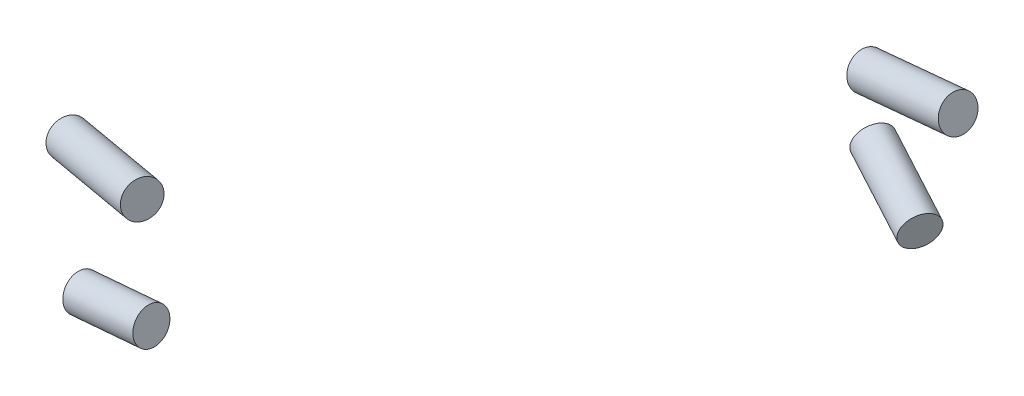
ISO-10303-21;
HEADER;
FILE_DESCRIPTION(('STEP AP214'),'2;1');
FILE_NAME('part.step','',(''),(''),'','','');
FILE_SCHEMA(('AUTOMOTIVE_DESIGN { 1 0 10303 214 1 1 1 1 }'));
ENDSEC;
DATA;
#1=APPLICATION_CONTEXT('core data for automotive mechanical design processes');
#2=APPLICATION_PROTOCOL_DEFINITION('international standard','automotive_design',2000,#1);
#3=PRODUCT_CONTEXT('',#1,'mechanical');
#4=PRODUCT('Part','Part','',(#3));
#5=PRODUCT_RELATED_PRODUCT_CATEGORY('part','',(#4));
#6=PRODUCT_DEFINITION_FORMATION('','',#4);
#7=PRODUCT_DEFINITION_CONTEXT('part definition',#1,'design');
#8=PRODUCT_DEFINITION('design','',#6,#7);
#9=PRODUCT_DEFINITION_SHAPE('','',#8);
#10=(LENGTH_UNIT() NAMED_UNIT(*) SI_UNIT(.MILLI.,.METRE.));
#11=(NAMED_UNIT(*) PLANE_ANGLE_UNIT() SI_UNIT($,.RADIAN.));
#12=(NAMED_UNIT(*) SI_UNIT($,.STERADIAN.) SOLID_ANGLE_UNIT());
#13=UNCERTAINTY_MEASURE_WITH_UNIT(LENGTH_MEASURE(1.E-05),#10,'distance_accuracy_value','');
#14=(GEOMETRIC_REPRESENTATION_CONTEXT(3) GLOBAL_UNCERTAINTY_ASSIGNED_CONTEXT((#13)) GLOBAL_UNIT_ASSIGNED_CONTEXT((#10,
#11,#12)) REPRESENTATION_CONTEXT('',''));
#15=CARTESIAN_POINT('',(0.,0.,0.));
#16=DIRECTION('',(0.,0.,1.));
#17=DIRECTION('',(1.,0.,0.));
#18=AXIS2_PLACEMENT_3D('',#15,#16,#17);
#19=CARTESIAN_POINT('',(-164.805861,4.04738961000001,-478.324842));
#20=DIRECTION('',(-0.971273965039373,-0.203382569261322,-0.123541148437916));
#21=DIRECTION('',(0.204952618983025,-0.978771895781647,0.));
#22=AXIS2_PLACEMENT_3D('',#19,#20,#21);
#23=PLANE('',#22);
#24=CARTESIAN_POINT('',(-164.805861,4.04738961000001,-478.324842));
#25=DIRECTION('',(-0.971273965039373,-0.203382569261322,-0.123541148437916));
#26=DIRECTION('',(0.204952618983025,-0.978771895781647,0.));
#27=AXIS2_PLACEMENT_3D('',#24,#25,#26);
#28=CIRCLE('',#27,7.00000000000002);
#29=CARTESIAN_POINT('',(-163.371192667119,-2.80401366047154,-478.324842));
#30=VERTEX_POINT('',#29);
#31=EDGE_CURVE('E80',#30,#30,#28,.T.);
#32=ORIENTED_EDGE('',*,*,#31,.F.);
#33=EDGE_LOOP('',(#32));
#34=FACE_BOUND('',#33,.T.);
#35=ADVANCED_FACE('F74',(#34),#23,.F.);
#36=CARTESIAN_POINT('',(-206.559789,-4.69578837999999,-483.635731));
#37=DIRECTION('',(-0.971273965039373,-0.203382569261322,-0.123541148437916));
#38=DIRECTION('',(0.204952618983025,-0.978771895781647,0.));
#39=AXIS2_PLACEMENT_3D('',#36,#37,#38);
#40=PLANE('',#39);
#41=CARTESIAN_POINT('',(-206.559789,-4.69578837999999,-483.635731));
#42=DIRECTION('',(-0.971273965039373,-0.203382569261322,-0.123541148437916));
#43=DIRECTION('',(0.204952618983025,-0.978771895781647,0.));
#44=AXIS2_PLACEMENT_3D('',#41,#42,#43);
#45=CIRCLE('',#44,7.00000000000002);
#46=CARTESIAN_POINT('',(-205.125120667119,-11.5471916504715,-483.635731));
#47=VERTEX_POINT('',#46);
#48=EDGE_CURVE('E12',#47,#47,#45,.T.);
#49=ORIENTED_EDGE('',*,*,#48,.T.);
#50=EDGE_LOOP('',(#49));
#51=FACE_BOUND('',#50,.T.);
#52=ADVANCED_FACE('F89',(#51),#40,.T.);
#53=CARTESIAN_POINT('',(-164.805861,4.04738961000001,-478.324842));
#54=DIRECTION('',(-0.971273965039373,-0.203382569261323,-0.123541148437915));
#55=DIRECTION('',(0.204952618983025,-0.978771895781647,0.));
#56=AXIS2_PLACEMENT_3D('',#53,#54,#55);
#57=CYLINDRICAL_SURFACE('',#56,7.00000000000002);
#58=ORIENTED_EDGE('',*,*,#48,.F.);
#59=EDGE_LOOP('',(#58));
#60=FACE_BOUND('',#59,.T.);
#61=ORIENTED_EDGE('',*,*,#31,.T.);
#62=EDGE_LOOP('',(#61));
#63=FACE_BOUND('',#62,.T.);
#64=ADVANCED_FACE('F86',(#60,#63),#57,.T.);
#65=CLOSED_SHELL('',(#35,#52,#64));
#66=MANIFOLD_SOLID_BREP('B2',#65);
#67=CARTESIAN_POINT('',(-166.026177,-30.2321009,-464.318765));
#68=DIRECTION('',(-0.89786021332966,0.222717447003682,-0.379794649935699));
#69=DIRECTION('',(-0.389579708465379,0.,0.920992752822751));
#70=AXIS2_PLACEMENT_3D('',#67,#68,#69);
#71=PLANE('',#70);
#72=CARTESIAN_POINT('',(-166.026177,-30.2321009,-464.318765));
#73=DIRECTION('',(-0.89786021332966,0.222717447003682,-0.379794649935699));
#74=DIRECTION('',(-0.389579708465379,0.,0.920992752822751));
#75=AXIS2_PLACEMENT_3D('',#72,#73,#74);
#76=CIRCLE('',#75,6.99999999999999);
#77=CARTESIAN_POINT('',(-168.753234959258,-30.2321009,-457.871815730241));
#78=VERTEX_POINT('',#77);
#79=EDGE_CURVE('E141',#78,#78,#76,.T.);
#80=ORIENTED_EDGE('',*,*,#79,.F.);
#81=EDGE_LOOP('',(#80));
#82=FACE_BOUND('',#81,.T.);
#83=ADVANCED_FACE('F135',(#82),#71,.F.);
#84=CARTESIAN_POINT('',(-198.557411,-22.1626116,-478.079469));
#85=DIRECTION('',(-0.89786021332966,0.222717447003682,-0.379794649935699));
#86=DIRECTION('',(-0.389579708465379,0.,0.920992752822751));
#87=AXIS2_PLACEMENT_3D('',#84,#85,#86);
#88=PLANE('',#87);
#89=CARTESIAN_POINT('',(-198.557411,-22.1626116,-478.079469));
#90=DIRECTION('',(-0.89786021332966,0.222717447003682,-0.379794649935699));
#91=DIRECTION('',(-0.389579708465379,0.,0.920992752822751));
#92=AXIS2_PLACEMENT_3D('',#89,#90,#91);
#93=CIRCLE('',#92,6.99999999999999);
#94=CARTESIAN_POINT('',(-201.284468959258,-22.1626116,-471.632519730241));
#95=VERTEX_POINT('',#94);
#96=EDGE_CURVE('E73',#95,#95,#93,.T.);
#97=ORIENTED_EDGE('',*,*,#96,.T.);
#98=EDGE_LOOP('',(#97));
#99=FACE_BOUND('',#98,.T.);
#100=ADVANCED_FACE('F150',(#99),#88,.T.);
#101=CARTESIAN_POINT('',(-166.026177,-30.2321009,-464.318765));
#102=DIRECTION('',(-0.89786021332966,0.222717447003683,-0.379794649935698));
#103=DIRECTION('',(-0.389579708465379,0.,0.920992752822752));
#104=AXIS2_PLACEMENT_3D('',#101,#102,#103);
#105=CYLINDRICAL_SURFACE('',#104,6.99999999999999);
#106=ORIENTED_EDGE('',*,*,#96,.F.);
#107=EDGE_LOOP('',(#106));
#108=FACE_BOUND('',#107,.T.);
#109=ORIENTED_EDGE('',*,*,#79,.T.);
#110=EDGE_LOOP('',(#109));
#111=FACE_BOUND('',#110,.T.);
#112=ADVANCED_FACE('F147',(#108,#111),#105,.T.);
#113=CLOSED_SHELL('',(#83,#100,#112));
#114=MANIFOLD_SOLID_BREP('B7',#113);
#115=CARTESIAN_POINT('',(-258.30426,43.4708888,-246.608444));
#116=DIRECTION('',(-0.951812297367077,-0.131402641187734,-0.277104125681476));
#117=DIRECTION('',(-0.279527889503172,0.,0.960137572949784));
#118=AXIS2_PLACEMENT_3D('',#115,#116,#117);
#119=PLANE('',#118);
#120=CARTESIAN_POINT('',(-258.30426,43.4708888,-246.608444));
#121=DIRECTION('',(-0.951812297367077,-0.131402641187734,-0.277104125681476));
#122=DIRECTION('',(-0.279527889503172,0.,0.960137572949784));
#123=AXIS2_PLACEMENT_3D('',#120,#121,#122);
#124=CIRCLE('',#123,7.);
#125=CARTESIAN_POINT('',(-260.260955226522,43.4708888,-239.887480989351));
#126=VERTEX_POINT('',#125);
#127=EDGE_CURVE('E201',#126,#126,#124,.T.);
#128=ORIENTED_EDGE('',*,*,#127,.F.);
#129=EDGE_LOOP('',(#128));
#130=FACE_BOUND('',#129,.T.);
#131=ADVANCED_FACE('F195',(#130),#119,.F.);
#132=CARTESIAN_POINT('',(-300.152615,37.6935056,-258.791888));
#133=DIRECTION('',(-0.951812297367077,-0.131402641187734,-0.277104125681476));
#134=DIRECTION('',(-0.279527889503172,0.,0.960137572949784));
#135=AXIS2_PLACEMENT_3D('',#132,#133,#134);
#136=PLANE('',#135);
#137=CARTESIAN_POINT('',(-300.152615,37.6935056,-258.791888));
#138=DIRECTION('',(-0.951812297367077,-0.131402641187734,-0.277104125681476));
#139=DIRECTION('',(-0.279527889503172,0.,0.960137572949784));
#140=AXIS2_PLACEMENT_3D('',#137,#138,#139);
#141=CIRCLE('',#140,7.);
#142=CARTESIAN_POINT('',(-302.109310226522,37.6935056,-252.070924989351));
#143=VERTEX_POINT('',#142);
#144=EDGE_CURVE('E134',#143,#143,#141,.T.);
#145=ORIENTED_EDGE('',*,*,#144,.T.);
#146=EDGE_LOOP('',(#145));
#147=FACE_BOUND('',#146,.T.);
#148=ADVANCED_FACE('F210',(#147),#136,.T.);
#149=CARTESIAN_POINT('',(-258.30426,43.4708888,-246.608444));
#150=DIRECTION('',(-0.951812297367076,-0.131402641187735,-0.277104125681479));
#151=DIRECTION('',(-0.279527889503174,0.,0.960137572949784));
#152=AXIS2_PLACEMENT_3D('',#149,#150,#151);
#153=CYLINDRICAL_SURFACE('',#152,7.);
#154=ORIENTED_EDGE('',*,*,#144,.F.);
#155=EDGE_LOOP('',(#154));
#156=FACE_BOUND('',#155,.T.);
#157=ORIENTED_EDGE('',*,*,#127,.T.);
#158=EDGE_LOOP('',(#157));
#159=FACE_BOUND('',#158,.T.);
#160=ADVANCED_FACE('F207',(#156,#159),#153,.T.);
#161=CLOSED_SHELL('',(#131,#148,#160));
#162=MANIFOLD_SOLID_BREP('B68',#161);
#163=CARTESIAN_POINT('',(-253.16093,3.06062272,-245.112504));
#164=DIRECTION('',(-0.990573329465155,-0.127894374356964,-0.0490663628176999));
#165=DIRECTION('',(0.128048606260967,-0.991767893428006,0.));
#166=AXIS2_PLACEMENT_3D('',#163,#164,#165);
#167=PLANE('',#166);
#168=CARTESIAN_POINT('',(-253.16093,3.06062272,-245.112504));
#169=DIRECTION('',(-0.990573329465155,-0.127894374356964,-0.0490663628176999));
#170=DIRECTION('',(0.128048606260967,-0.991767893428006,0.));
#171=AXIS2_PLACEMENT_3D('',#168,#169,#170);
#172=CIRCLE('',#171,7.00000000000001);
#173=CARTESIAN_POINT('',(-252.264589756173,-3.88175253399604,-245.112504));
#174=VERTEX_POINT('',#173);
#175=EDGE_CURVE('E254',#174,#174,#172,.T.);
#176=ORIENTED_EDGE('',*,*,#175,.F.);
#177=EDGE_LOOP('',(#176));
#178=FACE_BOUND('',#177,.T.);
#179=ADVANCED_FACE('F248',(#178),#167,.F.);
#180=CARTESIAN_POINT('',(-282.547385,-0.733505554000008,-246.568112));
#181=DIRECTION('',(-0.990573329465155,-0.127894374356964,-0.0490663628176999));
#182=DIRECTION('',(0.128048606260967,-0.991767893428006,0.));
#183=AXIS2_PLACEMENT_3D('',#180,#181,#182);
#184=PLANE('',#183);
#185=CARTESIAN_POINT('',(-282.547385,-0.733505554000008,-246.568112));
#186=DIRECTION('',(-0.990573329465155,-0.127894374356964,-0.0490663628176999));
#187=DIRECTION('',(0.128048606260967,-0.991767893428006,0.));
#188=AXIS2_PLACEMENT_3D('',#185,#186,#187);
#189=CIRCLE('',#188,7.00000000000001);
#190=CARTESIAN_POINT('',(-281.651044756173,-7.67588080799606,-246.568112));
#191=VERTEX_POINT('',#190);
#192=EDGE_CURVE('E194',#191,#191,#189,.T.);
#193=ORIENTED_EDGE('',*,*,#192,.T.);
#194=EDGE_LOOP('',(#193));
#195=FACE_BOUND('',#194,.T.);
#196=ADVANCED_FACE('F263',(#195),#184,.T.);
#197=CARTESIAN_POINT('',(-253.16093,3.06062272,-245.112504));
#198=DIRECTION('',(-0.990573329465155,-0.127894374356964,-0.0490663628177034));
#199=DIRECTION('',(0.128048606260967,-0.991767893428006,0.));
#200=AXIS2_PLACEMENT_3D('',#197,#198,#199);
#201=CYLINDRICAL_SURFACE('',#200,7.00000000000001);
#202=ORIENTED_EDGE('',*,*,#192,.F.);
#203=EDGE_LOOP('',(#202));
#204=FACE_BOUND('',#203,.T.);
#205=ORIENTED_EDGE('',*,*,#175,.T.);
#206=EDGE_LOOP('',(#205));
#207=FACE_BOUND('',#206,.T.);
#208=ADVANCED_FACE('F260',(#204,#207),#201,.T.);
#209=CLOSED_SHELL('',(#179,#196,#208));
#210=MANIFOLD_SOLID_BREP('B129',#209);
#211=ADVANCED_BREP_SHAPE_REPRESENTATION('',(#18,#66,#114,#162,#210),#14);
#212=SHAPE_DEFINITION_REPRESENTATION(#9,#211);
ENDSEC;
END-ISO-10303-21;
